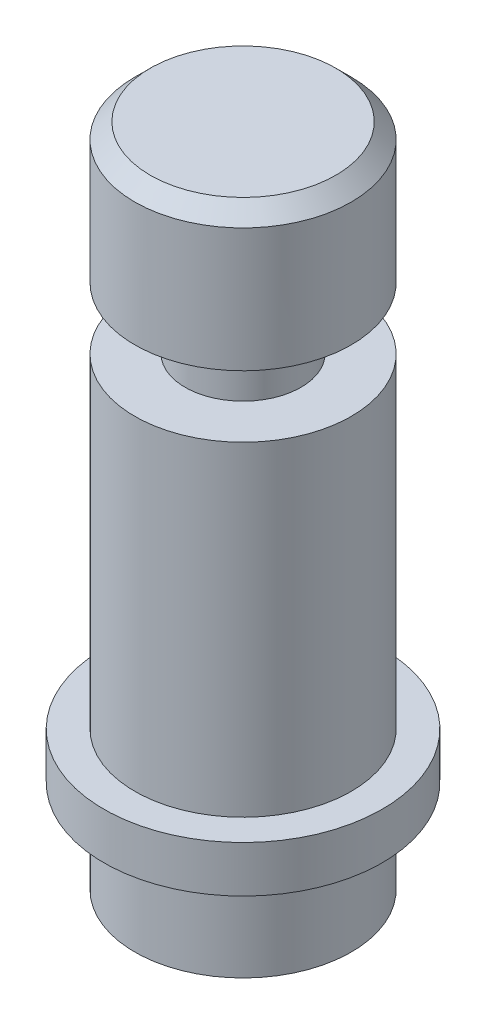
ISO-10303-21;
HEADER;
FILE_DESCRIPTION(('STEP AP214'),'2;1');
FILE_NAME('part.step','',(''),(''),'','','');
FILE_SCHEMA(('AUTOMOTIVE_DESIGN { 1 0 10303 214 1 1 1 1 }'));
ENDSEC;
DATA;
#1=APPLICATION_CONTEXT('core data for automotive mechanical design processes');
#2=APPLICATION_PROTOCOL_DEFINITION('international standard','automotive_design',2000,#1);
#3=PRODUCT_CONTEXT('',#1,'mechanical');
#4=PRODUCT('Part','Part','',(#3));
#5=PRODUCT_RELATED_PRODUCT_CATEGORY('part','',(#4));
#6=PRODUCT_DEFINITION_FORMATION('','',#4);
#7=PRODUCT_DEFINITION_CONTEXT('part definition',#1,'design');
#8=PRODUCT_DEFINITION('design','',#6,#7);
#9=PRODUCT_DEFINITION_SHAPE('','',#8);
#10=(LENGTH_UNIT() NAMED_UNIT(*) SI_UNIT(.MILLI.,.METRE.));
#11=(NAMED_UNIT(*) PLANE_ANGLE_UNIT() SI_UNIT($,.RADIAN.));
#12=(NAMED_UNIT(*) SI_UNIT($,.STERADIAN.) SOLID_ANGLE_UNIT());
#13=UNCERTAINTY_MEASURE_WITH_UNIT(LENGTH_MEASURE(1.E-05),#10,'distance_accuracy_value','');
#14=(GEOMETRIC_REPRESENTATION_CONTEXT(3) GLOBAL_UNCERTAINTY_ASSIGNED_CONTEXT((#13)) GLOBAL_UNIT_ASSIGNED_CONTEXT((#10,
#11,#12)) REPRESENTATION_CONTEXT('',''));
#15=CARTESIAN_POINT('',(0.,0.,0.));
#16=DIRECTION('',(0.,0.,1.));
#17=DIRECTION('',(1.,0.,0.));
#18=AXIS2_PLACEMENT_3D('',#15,#16,#17);
#19=CARTESIAN_POINT('',(0.,0.,0.));
#20=DIRECTION('',(0.,-1.,0.));
#21=DIRECTION('',(0.,0.,-1.));
#22=AXIS2_PLACEMENT_3D('',#19,#20,#21);
#23=PLANE('',#22);
#24=CARTESIAN_POINT('',(0.,0.,0.));
#25=DIRECTION('',(0.,-1.,0.));
#26=DIRECTION('',(0.,0.,-1.));
#27=AXIS2_PLACEMENT_3D('',#24,#25,#26);
#28=CIRCLE('',#27,7.);
#29=CARTESIAN_POINT('',(0.,0.,-7.));
#30=VERTEX_POINT('',#29);
#31=EDGE_CURVE('E48',#30,#30,#28,.T.);
#32=ORIENTED_EDGE('',*,*,#31,.T.);
#33=EDGE_LOOP('',(#32));
#34=FACE_BOUND('',#33,.T.);
#35=ADVANCED_FACE('F40',(#34),#23,.T.);
#36=CARTESIAN_POINT('',(0.,0.,0.));
#37=DIRECTION('',(0.,-1.,0.));
#38=DIRECTION('',(0.,0.,-1.));
#39=AXIS2_PLACEMENT_3D('',#36,#37,#38);
#40=CYLINDRICAL_SURFACE('',#39,7.);
#41=CARTESIAN_POINT('',(0.,5.99999999999999,0.));
#42=DIRECTION('',(0.,-1.,0.));
#43=DIRECTION('',(0.,0.,-1.));
#44=AXIS2_PLACEMENT_3D('',#41,#42,#43);
#45=CIRCLE('',#44,7.);
#46=CARTESIAN_POINT('',(0.,5.99999999999999,-7.));
#47=VERTEX_POINT('',#46);
#48=EDGE_CURVE('E55',#47,#47,#45,.T.);
#49=ORIENTED_EDGE('',*,*,#48,.T.);
#50=EDGE_LOOP('',(#49));
#51=FACE_BOUND('',#50,.T.);
#52=ORIENTED_EDGE('',*,*,#31,.F.);
#53=EDGE_LOOP('',(#52));
#54=FACE_BOUND('',#53,.T.);
#55=ADVANCED_FACE('F94',(#51,#54),#40,.T.);
#56=CARTESIAN_POINT('',(7.,5.99999999999999,0.));
#57=DIRECTION('',(0.,-1.,0.));
#58=DIRECTION('',(0.,0.,-1.));
#59=AXIS2_PLACEMENT_3D('',#56,#57,#58);
#60=PLANE('',#59);
#61=CARTESIAN_POINT('',(0.,5.99999999999999,0.));
#62=DIRECTION('',(0.,-1.,0.));
#63=DIRECTION('',(0.,0.,-1.));
#64=AXIS2_PLACEMENT_3D('',#61,#62,#63);
#65=CIRCLE('',#64,9.);
#66=CARTESIAN_POINT('',(0.,5.99999999999999,-9.));
#67=VERTEX_POINT('',#66);
#68=EDGE_CURVE('E60',#67,#67,#65,.T.);
#69=ORIENTED_EDGE('',*,*,#68,.T.);
#70=EDGE_LOOP('',(#69));
#71=FACE_BOUND('',#70,.T.);
#72=ORIENTED_EDGE('',*,*,#48,.F.);
#73=EDGE_LOOP('',(#72));
#74=FACE_BOUND('',#73,.T.);
#75=ADVANCED_FACE('F97',(#71,#74),#60,.T.);
#76=CARTESIAN_POINT('',(0.,0.,0.));
#77=DIRECTION('',(0.,-1.,0.));
#78=DIRECTION('',(0.,0.,-1.));
#79=AXIS2_PLACEMENT_3D('',#76,#77,#78);
#80=CYLINDRICAL_SURFACE('',#79,9.);
#81=CARTESIAN_POINT('',(0.,8.99999999999999,0.));
#82=DIRECTION('',(0.,-1.,0.));
#83=DIRECTION('',(0.,0.,-1.));
#84=AXIS2_PLACEMENT_3D('',#81,#82,#83);
#85=CIRCLE('',#84,9.);
#86=CARTESIAN_POINT('',(0.,8.99999999999999,-9.));
#87=VERTEX_POINT('',#86);
#88=EDGE_CURVE('E58',#87,#87,#85,.T.);
#89=ORIENTED_EDGE('',*,*,#88,.T.);
#90=EDGE_LOOP('',(#89));
#91=FACE_BOUND('',#90,.T.);
#92=ORIENTED_EDGE('',*,*,#68,.F.);
#93=EDGE_LOOP('',(#92));
#94=FACE_BOUND('',#93,.T.);
#95=ADVANCED_FACE('F104',(#91,#94),#80,.T.);
#96=CARTESIAN_POINT('',(9.,8.99999999999999,0.));
#97=DIRECTION('',(0.,1.,0.));
#98=DIRECTION('',(0.,0.,1.));
#99=AXIS2_PLACEMENT_3D('',#96,#97,#98);
#100=PLANE('',#99);
#101=CARTESIAN_POINT('',(0.,8.99999999999999,0.));
#102=DIRECTION('',(0.,-1.,0.));
#103=DIRECTION('',(0.,0.,-1.));
#104=AXIS2_PLACEMENT_3D('',#101,#102,#103);
#105=CIRCLE('',#104,7.);
#106=CARTESIAN_POINT('',(0.,8.99999999999999,-7.));
#107=VERTEX_POINT('',#106);
#108=EDGE_CURVE('E64',#107,#107,#105,.T.);
#109=ORIENTED_EDGE('',*,*,#108,.T.);
#110=EDGE_LOOP('',(#109));
#111=FACE_BOUND('',#110,.T.);
#112=ORIENTED_EDGE('',*,*,#88,.F.);
#113=EDGE_LOOP('',(#112));
#114=FACE_BOUND('',#113,.T.);
#115=ADVANCED_FACE('F108',(#111,#114),#100,.T.);
#116=CARTESIAN_POINT('',(0.,0.,0.));
#117=DIRECTION('',(0.,-1.,0.));
#118=DIRECTION('',(0.,0.,-1.));
#119=AXIS2_PLACEMENT_3D('',#116,#117,#118);
#120=CYLINDRICAL_SURFACE('',#119,7.);
#121=CARTESIAN_POINT('',(0.,30.,0.));
#122=DIRECTION('',(0.,-1.,0.));
#123=DIRECTION('',(0.,0.,-1.));
#124=AXIS2_PLACEMENT_3D('',#121,#122,#123);
#125=CIRCLE('',#124,7.);
#126=CARTESIAN_POINT('',(0.,30.,-7.));
#127=VERTEX_POINT('',#126);
#128=EDGE_CURVE('E66',#127,#127,#125,.T.);
#129=ORIENTED_EDGE('',*,*,#128,.T.);
#130=EDGE_LOOP('',(#129));
#131=FACE_BOUND('',#130,.T.);
#132=ORIENTED_EDGE('',*,*,#108,.F.);
#133=EDGE_LOOP('',(#132));
#134=FACE_BOUND('',#133,.T.);
#135=ADVANCED_FACE('F114',(#131,#134),#120,.T.);
#136=CARTESIAN_POINT('',(7.,30.,0.));
#137=DIRECTION('',(0.,1.,0.));
#138=DIRECTION('',(0.,0.,1.));
#139=AXIS2_PLACEMENT_3D('',#136,#137,#138);
#140=PLANE('',#139);
#141=CARTESIAN_POINT('',(0.,30.,0.));
#142=DIRECTION('',(0.,-1.,0.));
#143=DIRECTION('',(0.,0.,-1.));
#144=AXIS2_PLACEMENT_3D('',#141,#142,#143);
#145=CIRCLE('',#144,3.75);
#146=CARTESIAN_POINT('',(0.,30.,-3.75));
#147=VERTEX_POINT('',#146);
#148=EDGE_CURVE('E68',#147,#147,#145,.T.);
#149=ORIENTED_EDGE('',*,*,#148,.T.);
#150=EDGE_LOOP('',(#149));
#151=FACE_BOUND('',#150,.T.);
#152=ORIENTED_EDGE('',*,*,#128,.F.);
#153=EDGE_LOOP('',(#152));
#154=FACE_BOUND('',#153,.T.);
#155=ADVANCED_FACE('F120',(#151,#154),#140,.T.);
#156=CARTESIAN_POINT('',(0.,0.,0.));
#157=DIRECTION('',(0.,-1.,0.));
#158=DIRECTION('',(0.,0.,-1.));
#159=AXIS2_PLACEMENT_3D('',#156,#157,#158);
#160=CYLINDRICAL_SURFACE('',#159,3.75);
#161=CARTESIAN_POINT('',(0.,34.,0.));
#162=DIRECTION('',(0.,-1.,0.));
#163=DIRECTION('',(0.,0.,-1.));
#164=AXIS2_PLACEMENT_3D('',#161,#162,#163);
#165=CIRCLE('',#164,3.75);
#166=CARTESIAN_POINT('',(0.,34.,-3.75));
#167=VERTEX_POINT('',#166);
#168=EDGE_CURVE('E75',#167,#167,#165,.T.);
#169=ORIENTED_EDGE('',*,*,#168,.T.);
#170=EDGE_LOOP('',(#169));
#171=FACE_BOUND('',#170,.T.);
#172=ORIENTED_EDGE('',*,*,#148,.F.);
#173=EDGE_LOOP('',(#172));
#174=FACE_BOUND('',#173,.T.);
#175=ADVANCED_FACE('F93',(#171,#174),#160,.T.);
#176=CARTESIAN_POINT('',(3.75,34.,0.));
#177=DIRECTION('',(0.,-1.,0.));
#178=DIRECTION('',(0.,0.,-1.));
#179=AXIS2_PLACEMENT_3D('',#176,#177,#178);
#180=PLANE('',#179);
#181=CARTESIAN_POINT('',(0.,34.,0.));
#182=DIRECTION('',(0.,-1.,0.));
#183=DIRECTION('',(0.,0.,-1.));
#184=AXIS2_PLACEMENT_3D('',#181,#182,#183);
#185=CIRCLE('',#184,7.);
#186=CARTESIAN_POINT('',(0.,34.,-7.));
#187=VERTEX_POINT('',#186);
#188=EDGE_CURVE('E73',#187,#187,#185,.T.);
#189=ORIENTED_EDGE('',*,*,#188,.T.);
#190=EDGE_LOOP('',(#189));
#191=FACE_BOUND('',#190,.T.);
#192=ORIENTED_EDGE('',*,*,#168,.F.);
#193=EDGE_LOOP('',(#192));
#194=FACE_BOUND('',#193,.T.);
#195=ADVANCED_FACE('F76',(#191,#194),#180,.T.);
#196=CARTESIAN_POINT('',(0.,0.,0.));
#197=DIRECTION('',(0.,-1.,0.));
#198=DIRECTION('',(0.,0.,-1.));
#199=AXIS2_PLACEMENT_3D('',#196,#197,#198);
#200=CYLINDRICAL_SURFACE('',#199,7.);
#201=CARTESIAN_POINT('',(0.,42.,0.));
#202=DIRECTION('',(0.,1.,0.));
#203=DIRECTION('',(0.,0.,1.));
#204=AXIS2_PLACEMENT_3D('',#201,#202,#203);
#205=CIRCLE('',#204,7.);
#206=CARTESIAN_POINT('',(0.,42.,7.));
#207=VERTEX_POINT('',#206);
#208=EDGE_CURVE('E42',#207,#207,#205,.F.);
#209=ORIENTED_EDGE('',*,*,#208,.T.);
#210=EDGE_LOOP('',(#209));
#211=FACE_BOUND('',#210,.T.);
#212=ORIENTED_EDGE('',*,*,#188,.F.);
#213=EDGE_LOOP('',(#212));
#214=FACE_BOUND('',#213,.T.);
#215=ADVANCED_FACE('F85',(#211,#214),#200,.T.);
#216=CARTESIAN_POINT('',(7.,43.,0.));
#217=DIRECTION('',(0.,1.,0.));
#218=DIRECTION('',(0.,0.,1.));
#219=AXIS2_PLACEMENT_3D('',#216,#217,#218);
#220=PLANE('',#219);
#221=CARTESIAN_POINT('',(0.,43.,0.));
#222=DIRECTION('',(0.,1.,0.));
#223=DIRECTION('',(0.,0.,1.));
#224=AXIS2_PLACEMENT_3D('',#221,#222,#223);
#225=CIRCLE('',#224,5.99999999999999);
#226=CARTESIAN_POINT('',(0.,43.,5.99999999999999));
#227=VERTEX_POINT('',#226);
#228=EDGE_CURVE('E10',#227,#227,#225,.T.);
#229=ORIENTED_EDGE('',*,*,#228,.T.);
#230=EDGE_LOOP('',(#229));
#231=FACE_BOUND('',#230,.T.);
#232=ADVANCED_FACE('F83',(#231),#220,.T.);
#233=CARTESIAN_POINT('',(0.,42.,0.));
#234=DIRECTION('',(0.,-1.,0.));
#235=DIRECTION('',(0.,0.,-1.));
#236=AXIS2_PLACEMENT_3D('',#233,#234,#235);
#237=CONICAL_SURFACE('',#236,7.,0.785398163397452);
#238=ORIENTED_EDGE('',*,*,#228,.F.);
#239=EDGE_LOOP('',(#238));
#240=FACE_BOUND('',#239,.T.);
#241=ORIENTED_EDGE('',*,*,#208,.F.);
#242=EDGE_LOOP('',(#241));
#243=FACE_BOUND('',#242,.T.);
#244=ADVANCED_FACE('F39',(#240,#243),#237,.T.);
#245=CLOSED_SHELL('',(#35,#55,#75,#95,#115,#135,#155,#175,#195,#215,#232,#244));
#246=MANIFOLD_SOLID_BREP('B2',#245);
#247=ADVANCED_BREP_SHAPE_REPRESENTATION('',(#18,#246),#14);
#248=SHAPE_DEFINITION_REPRESENTATION(#9,#247);
ENDSEC;
END-ISO-10303-21;
